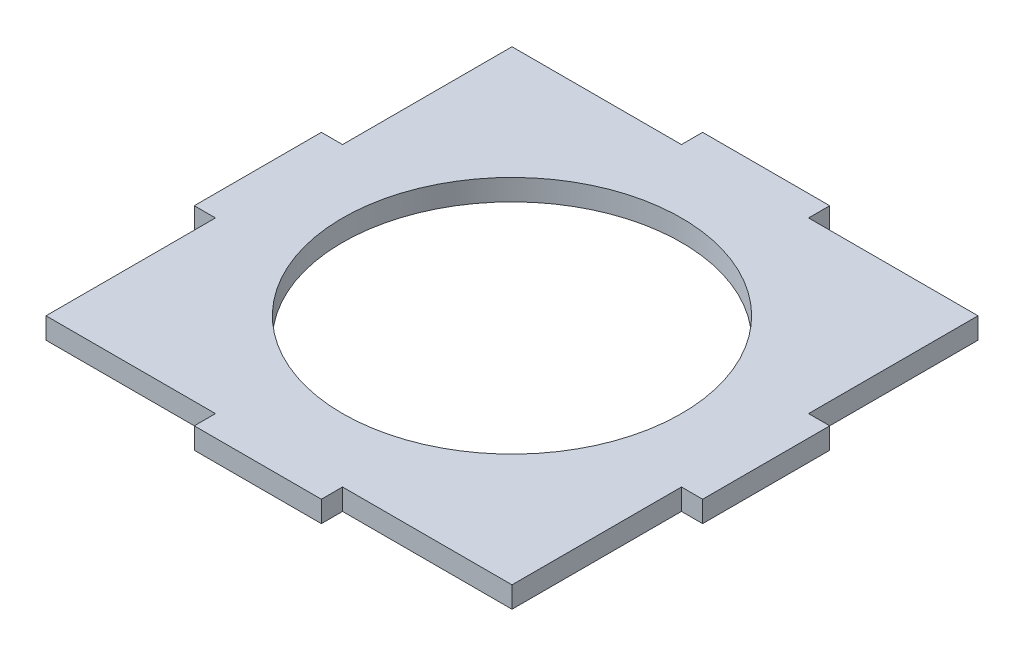
ISO-10303-21;
HEADER;
FILE_DESCRIPTION(('STEP AP214'),'2;1');
FILE_NAME('part.step','',(''),(''),'','','');
FILE_SCHEMA(('AUTOMOTIVE_DESIGN { 1 0 10303 214 1 1 1 1 }'));
ENDSEC;
DATA;
#1=APPLICATION_CONTEXT('core data for automotive mechanical design processes');
#2=APPLICATION_PROTOCOL_DEFINITION('international standard','automotive_design',2000,#1);
#3=PRODUCT_CONTEXT('',#1,'mechanical');
#4=PRODUCT('Part','Part','',(#3));
#5=PRODUCT_RELATED_PRODUCT_CATEGORY('part','',(#4));
#6=PRODUCT_DEFINITION_FORMATION('','',#4);
#7=PRODUCT_DEFINITION_CONTEXT('part definition',#1,'design');
#8=PRODUCT_DEFINITION('design','',#6,#7);
#9=PRODUCT_DEFINITION_SHAPE('','',#8);
#10=(LENGTH_UNIT() NAMED_UNIT(*) SI_UNIT(.MILLI.,.METRE.));
#11=(NAMED_UNIT(*) PLANE_ANGLE_UNIT() SI_UNIT($,.RADIAN.));
#12=(NAMED_UNIT(*) SI_UNIT($,.STERADIAN.) SOLID_ANGLE_UNIT());
#13=UNCERTAINTY_MEASURE_WITH_UNIT(LENGTH_MEASURE(1.E-05),#10,'distance_accuracy_value','');
#14=(GEOMETRIC_REPRESENTATION_CONTEXT(3) GLOBAL_UNCERTAINTY_ASSIGNED_CONTEXT((#13)) GLOBAL_UNIT_ASSIGNED_CONTEXT((#10,
#11,#12)) REPRESENTATION_CONTEXT('',''));
#15=CARTESIAN_POINT('',(0.,0.,0.));
#16=DIRECTION('',(0.,0.,1.));
#17=DIRECTION('',(1.,0.,0.));
#18=AXIS2_PLACEMENT_3D('',#15,#16,#17);
#19=CARTESIAN_POINT('',(0.,6.35,27.1778189414841));
#20=DIRECTION('',(0.,0.,-1.));
#21=DIRECTION('',(-1.,0.,0.));
#22=AXIS2_PLACEMENT_3D('',#19,#20,#21);
#23=PLANE('',#22);
#24=DIRECTION('',(1.,0.,0.));
#25=VECTOR('',#24,1.);
#26=CARTESIAN_POINT('',(0.,0.,27.1778189414841));
#27=LINE('',#26,#25);
#28=CARTESIAN_POINT('',(-42.6264417650752,0.,27.1778189414841));
#29=VERTEX_POINT('',#28);
#30=CARTESIAN_POINT('',(8.17355823492479,0.,27.1778189414841));
#31=VERTEX_POINT('',#30);
#32=EDGE_CURVE('E204',#29,#31,#27,.T.);
#33=ORIENTED_EDGE('',*,*,#32,.T.);
#34=DIRECTION('',(0.,-1.,0.));
#35=VECTOR('',#34,1.);
#36=CARTESIAN_POINT('',(8.17355823492479,6.35,27.1778189414841));
#37=LINE('',#36,#35);
#38=CARTESIAN_POINT('',(8.17355823492479,6.35,27.1778189414841));
#39=VERTEX_POINT('',#38);
#40=EDGE_CURVE('E11',#39,#31,#37,.T.);
#41=ORIENTED_EDGE('',*,*,#40,.F.);
#42=DIRECTION('',(1.,0.,0.));
#43=VECTOR('',#42,1.);
#44=CARTESIAN_POINT('',(0.,6.35,27.1778189414841));
#45=LINE('',#44,#43);
#46=CARTESIAN_POINT('',(-42.6264417650752,6.35,27.1778189414841));
#47=VERTEX_POINT('',#46);
#48=EDGE_CURVE('E305',#47,#39,#45,.T.);
#49=ORIENTED_EDGE('',*,*,#48,.F.);
#50=DIRECTION('',(0.,-1.,0.));
#51=VECTOR('',#50,1.);
#52=CARTESIAN_POINT('',(-42.6264417650752,6.35,27.1778189414841));
#53=LINE('',#52,#51);
#54=EDGE_CURVE('E196',#47,#29,#53,.T.);
#55=ORIENTED_EDGE('',*,*,#54,.T.);
#56=EDGE_LOOP('',(#33,#41,#49,#55));
#57=FACE_BOUND('',#56,.T.);
#58=ADVANCED_FACE('F33',(#57),#23,.F.);
#59=CARTESIAN_POINT('',(8.17355823492479,6.35,0.));
#60=DIRECTION('',(1.,0.,0.));
#61=DIRECTION('',(0.,0.,-1.));
#62=AXIS2_PLACEMENT_3D('',#59,#60,#61);
#63=PLANE('',#62);
#64=DIRECTION('',(0.,0.,1.));
#65=VECTOR('',#64,1.);
#66=CARTESIAN_POINT('',(8.17355823492479,0.,0.));
#67=LINE('',#66,#65);
#68=CARTESIAN_POINT('',(8.17355823492479,0.,33.5278189414841));
#69=VERTEX_POINT('',#68);
#70=EDGE_CURVE('E207',#31,#69,#67,.T.);
#71=ORIENTED_EDGE('',*,*,#70,.T.);
#72=DIRECTION('',(0.,-1.,0.));
#73=VECTOR('',#72,1.);
#74=CARTESIAN_POINT('',(8.17355823492479,6.35,33.5278189414841));
#75=LINE('',#74,#73);
#76=CARTESIAN_POINT('',(8.17355823492479,6.35,33.5278189414841));
#77=VERTEX_POINT('',#76);
#78=EDGE_CURVE('E42',#77,#69,#75,.T.);
#79=ORIENTED_EDGE('',*,*,#78,.F.);
#80=DIRECTION('',(0.,0.,1.));
#81=VECTOR('',#80,1.);
#82=CARTESIAN_POINT('',(8.17355823492479,6.35,0.));
#83=LINE('',#82,#81);
#84=EDGE_CURVE('E125',#39,#77,#83,.T.);
#85=ORIENTED_EDGE('',*,*,#84,.F.);
#86=ORIENTED_EDGE('',*,*,#40,.T.);
#87=EDGE_LOOP('',(#71,#79,#85,#86));
#88=FACE_BOUND('',#87,.T.);
#89=ADVANCED_FACE('F288',(#88),#63,.F.);
#90=CARTESIAN_POINT('',(0.,6.35,33.5278189414841));
#91=DIRECTION('',(0.,0.,1.));
#92=DIRECTION('',(1.,0.,0.));
#93=AXIS2_PLACEMENT_3D('',#90,#91,#92);
#94=PLANE('',#93);
#95=DIRECTION('',(-1.,0.,0.));
#96=VECTOR('',#95,1.);
#97=CARTESIAN_POINT('',(0.,0.,33.5278189414841));
#98=LINE('',#97,#96);
#99=CARTESIAN_POINT('',(46.2735582349248,0.,33.5278189414841));
#100=VERTEX_POINT('',#99);
#101=EDGE_CURVE('E211',#100,#69,#98,.T.);
#102=ORIENTED_EDGE('',*,*,#101,.F.);
#103=DIRECTION('',(0.,-1.,0.));
#104=VECTOR('',#103,1.);
#105=CARTESIAN_POINT('',(46.2735582349248,6.35,33.5278189414841));
#106=LINE('',#105,#104);
#107=CARTESIAN_POINT('',(46.2735582349248,6.35,33.5278189414841));
#108=VERTEX_POINT('',#107);
#109=EDGE_CURVE('E281',#108,#100,#106,.T.);
#110=ORIENTED_EDGE('',*,*,#109,.F.);
#111=DIRECTION('',(-1.,0.,0.));
#112=VECTOR('',#111,1.);
#113=CARTESIAN_POINT('',(0.,6.35,33.5278189414841));
#114=LINE('',#113,#112);
#115=EDGE_CURVE('E287',#108,#77,#114,.T.);
#116=ORIENTED_EDGE('',*,*,#115,.T.);
#117=ORIENTED_EDGE('',*,*,#78,.T.);
#118=EDGE_LOOP('',(#102,#110,#116,#117));
#119=FACE_BOUND('',#118,.T.);
#120=ADVANCED_FACE('F285',(#119),#94,.T.);
#121=CARTESIAN_POINT('',(46.2735582349248,6.35,0.));
#122=DIRECTION('',(1.,0.,0.));
#123=DIRECTION('',(0.,0.,-1.));
#124=AXIS2_PLACEMENT_3D('',#121,#122,#123);
#125=PLANE('',#124);
#126=DIRECTION('',(0.,0.,1.));
#127=VECTOR('',#126,1.);
#128=CARTESIAN_POINT('',(46.2735582349248,0.,0.));
#129=LINE('',#128,#127);
#130=CARTESIAN_POINT('',(46.2735582349248,0.,27.1778189414841));
#131=VERTEX_POINT('',#130);
#132=EDGE_CURVE('E214',#131,#100,#129,.T.);
#133=ORIENTED_EDGE('',*,*,#132,.F.);
#134=DIRECTION('',(0.,-1.,0.));
#135=VECTOR('',#134,1.);
#136=CARTESIAN_POINT('',(46.2735582349248,6.35,27.1778189414841));
#137=LINE('',#136,#135);
#138=CARTESIAN_POINT('',(46.2735582349248,6.35,27.1778189414841));
#139=VERTEX_POINT('',#138);
#140=EDGE_CURVE('E279',#139,#131,#137,.T.);
#141=ORIENTED_EDGE('',*,*,#140,.F.);
#142=DIRECTION('',(0.,0.,1.));
#143=VECTOR('',#142,1.);
#144=CARTESIAN_POINT('',(46.2735582349248,6.35,0.));
#145=LINE('',#144,#143);
#146=EDGE_CURVE('E301',#139,#108,#145,.T.);
#147=ORIENTED_EDGE('',*,*,#146,.T.);
#148=ORIENTED_EDGE('',*,*,#109,.T.);
#149=EDGE_LOOP('',(#133,#141,#147,#148));
#150=FACE_BOUND('',#149,.T.);
#151=ADVANCED_FACE('F297',(#150),#125,.T.);
#152=CARTESIAN_POINT('',(97.0735582349248,0.,27.1778189414841));
#153=VERTEX_POINT('',#152);
#154=EDGE_CURVE('E208',#131,#153,#27,.T.);
#155=ORIENTED_EDGE('',*,*,#154,.T.);
#156=DIRECTION('',(0.,-1.,0.));
#157=VECTOR('',#156,1.);
#158=CARTESIAN_POINT('',(97.0735582349248,6.35,27.1778189414841));
#159=LINE('',#158,#157);
#160=CARTESIAN_POINT('',(97.0735582349248,6.35,27.1778189414841));
#161=VERTEX_POINT('',#160);
#162=EDGE_CURVE('E277',#161,#153,#159,.T.);
#163=ORIENTED_EDGE('',*,*,#162,.F.);
#164=EDGE_CURVE('E303',#139,#161,#45,.T.);
#165=ORIENTED_EDGE('',*,*,#164,.F.);
#166=ORIENTED_EDGE('',*,*,#140,.T.);
#167=EDGE_LOOP('',(#155,#163,#165,#166));
#168=FACE_BOUND('',#167,.T.);
#169=ADVANCED_FACE('F360',(#168),#23,.F.);
#170=CARTESIAN_POINT('',(97.0735582349248,6.35,0.));
#171=DIRECTION('',(1.,0.,0.));
#172=DIRECTION('',(0.,0.,-1.));
#173=AXIS2_PLACEMENT_3D('',#170,#171,#172);
#174=PLANE('',#173);
#175=DIRECTION('',(0.,0.,1.));
#176=VECTOR('',#175,1.);
#177=CARTESIAN_POINT('',(97.0735582349248,0.,0.));
#178=LINE('',#177,#176);
#179=CARTESIAN_POINT('',(97.0735582349248,0.,-23.6221810585159));
#180=VERTEX_POINT('',#179);
#181=EDGE_CURVE('E217',#180,#153,#178,.T.);
#182=ORIENTED_EDGE('',*,*,#181,.F.);
#183=DIRECTION('',(0.,-1.,0.));
#184=VECTOR('',#183,1.);
#185=CARTESIAN_POINT('',(97.0735582349248,6.35,-23.6221810585159));
#186=LINE('',#185,#184);
#187=CARTESIAN_POINT('',(97.0735582349248,6.35,-23.6221810585159));
#188=VERTEX_POINT('',#187);
#189=EDGE_CURVE('E275',#188,#180,#186,.T.);
#190=ORIENTED_EDGE('',*,*,#189,.F.);
#191=DIRECTION('',(0.,0.,1.));
#192=VECTOR('',#191,1.);
#193=CARTESIAN_POINT('',(97.0735582349248,6.35,0.));
#194=LINE('',#193,#192);
#195=EDGE_CURVE('E309',#188,#161,#194,.T.);
#196=ORIENTED_EDGE('',*,*,#195,.T.);
#197=ORIENTED_EDGE('',*,*,#162,.T.);
#198=EDGE_LOOP('',(#182,#190,#196,#197));
#199=FACE_BOUND('',#198,.T.);
#200=ADVANCED_FACE('F363',(#199),#174,.T.);
#201=CARTESIAN_POINT('',(0.,6.35,-23.6221810585158));
#202=DIRECTION('',(0.,0.,-1.));
#203=DIRECTION('',(-1.,0.,0.));
#204=AXIS2_PLACEMENT_3D('',#201,#202,#203);
#205=PLANE('',#204);
#206=DIRECTION('',(1.,0.,0.));
#207=VECTOR('',#206,1.);
#208=CARTESIAN_POINT('',(0.,0.,-23.6221810585158));
#209=LINE('',#208,#207);
#210=CARTESIAN_POINT('',(103.423558234925,0.,-23.6221810585159));
#211=VERTEX_POINT('',#210);
#212=EDGE_CURVE('E220',#180,#211,#209,.T.);
#213=ORIENTED_EDGE('',*,*,#212,.T.);
#214=DIRECTION('',(0.,-1.,0.));
#215=VECTOR('',#214,1.);
#216=CARTESIAN_POINT('',(103.423558234925,6.35,-23.6221810585159));
#217=LINE('',#216,#215);
#218=CARTESIAN_POINT('',(103.423558234925,6.35,-23.6221810585159));
#219=VERTEX_POINT('',#218);
#220=EDGE_CURVE('E272',#219,#211,#217,.T.);
#221=ORIENTED_EDGE('',*,*,#220,.F.);
#222=DIRECTION('',(1.,0.,0.));
#223=VECTOR('',#222,1.);
#224=CARTESIAN_POINT('',(0.,6.35,-23.6221810585158));
#225=LINE('',#224,#223);
#226=EDGE_CURVE('E312',#188,#219,#225,.T.);
#227=ORIENTED_EDGE('',*,*,#226,.F.);
#228=ORIENTED_EDGE('',*,*,#189,.T.);
#229=EDGE_LOOP('',(#213,#221,#227,#228));
#230=FACE_BOUND('',#229,.T.);
#231=ADVANCED_FACE('F368',(#230),#205,.F.);
#232=CARTESIAN_POINT('',(103.423558234925,6.35,0.));
#233=DIRECTION('',(-1.,0.,0.));
#234=DIRECTION('',(0.,0.,1.));
#235=AXIS2_PLACEMENT_3D('',#232,#233,#234);
#236=PLANE('',#235);
#237=DIRECTION('',(0.,0.,-1.));
#238=VECTOR('',#237,1.);
#239=CARTESIAN_POINT('',(103.423558234925,0.,0.));
#240=LINE('',#239,#238);
#241=CARTESIAN_POINT('',(103.423558234925,0.,-61.7221810585159));
#242=VERTEX_POINT('',#241);
#243=EDGE_CURVE('E223',#211,#242,#240,.T.);
#244=ORIENTED_EDGE('',*,*,#243,.T.);
#245=DIRECTION('',(0.,-1.,0.));
#246=VECTOR('',#245,1.);
#247=CARTESIAN_POINT('',(103.423558234925,6.35,-61.7221810585159));
#248=LINE('',#247,#246);
#249=CARTESIAN_POINT('',(103.423558234925,6.35,-61.7221810585159));
#250=VERTEX_POINT('',#249);
#251=EDGE_CURVE('E270',#250,#242,#248,.T.);
#252=ORIENTED_EDGE('',*,*,#251,.F.);
#253=DIRECTION('',(0.,0.,-1.));
#254=VECTOR('',#253,1.);
#255=CARTESIAN_POINT('',(103.423558234925,6.35,0.));
#256=LINE('',#255,#254);
#257=EDGE_CURVE('E315',#219,#250,#256,.T.);
#258=ORIENTED_EDGE('',*,*,#257,.F.);
#259=ORIENTED_EDGE('',*,*,#220,.T.);
#260=EDGE_LOOP('',(#244,#252,#258,#259));
#261=FACE_BOUND('',#260,.T.);
#262=ADVANCED_FACE('F375',(#261),#236,.F.);
#263=CARTESIAN_POINT('',(0.,6.35,-61.7221810585158));
#264=DIRECTION('',(0.,0.,-1.));
#265=DIRECTION('',(-1.,0.,0.));
#266=AXIS2_PLACEMENT_3D('',#263,#264,#265);
#267=PLANE('',#266);
#268=DIRECTION('',(1.,0.,0.));
#269=VECTOR('',#268,1.);
#270=CARTESIAN_POINT('',(0.,0.,-61.7221810585158));
#271=LINE('',#270,#269);
#272=CARTESIAN_POINT('',(97.0735582349248,0.,-61.7221810585159));
#273=VERTEX_POINT('',#272);
#274=EDGE_CURVE('E226',#273,#242,#271,.T.);
#275=ORIENTED_EDGE('',*,*,#274,.F.);
#276=DIRECTION('',(0.,-1.,0.));
#277=VECTOR('',#276,1.);
#278=CARTESIAN_POINT('',(97.0735582349248,6.35,-61.7221810585159));
#279=LINE('',#278,#277);
#280=CARTESIAN_POINT('',(97.0735582349248,6.35,-61.7221810585159));
#281=VERTEX_POINT('',#280);
#282=EDGE_CURVE('E268',#281,#273,#279,.T.);
#283=ORIENTED_EDGE('',*,*,#282,.F.);
#284=DIRECTION('',(1.,0.,0.));
#285=VECTOR('',#284,1.);
#286=CARTESIAN_POINT('',(0.,6.35,-61.7221810585158));
#287=LINE('',#286,#285);
#288=EDGE_CURVE('E317',#281,#250,#287,.T.);
#289=ORIENTED_EDGE('',*,*,#288,.T.);
#290=ORIENTED_EDGE('',*,*,#251,.T.);
#291=EDGE_LOOP('',(#275,#283,#289,#290));
#292=FACE_BOUND('',#291,.T.);
#293=ADVANCED_FACE('F379',(#292),#267,.T.);
#294=CARTESIAN_POINT('',(97.0735582349248,0.,-112.522181058516));
#295=VERTEX_POINT('',#294);
#296=EDGE_CURVE('E221',#295,#273,#178,.T.);
#297=ORIENTED_EDGE('',*,*,#296,.F.);
#298=DIRECTION('',(0.,-1.,0.));
#299=VECTOR('',#298,1.);
#300=CARTESIAN_POINT('',(97.0735582349248,6.35,-112.522181058516));
#301=LINE('',#300,#299);
#302=CARTESIAN_POINT('',(97.0735582349248,6.35,-112.522181058516));
#303=VERTEX_POINT('',#302);
#304=EDGE_CURVE('E266',#303,#295,#301,.T.);
#305=ORIENTED_EDGE('',*,*,#304,.F.);
#306=EDGE_CURVE('E313',#303,#281,#194,.T.);
#307=ORIENTED_EDGE('',*,*,#306,.T.);
#308=ORIENTED_EDGE('',*,*,#282,.T.);
#309=EDGE_LOOP('',(#297,#305,#307,#308));
#310=FACE_BOUND('',#309,.T.);
#311=ADVANCED_FACE('F383',(#310),#174,.T.);
#312=CARTESIAN_POINT('',(0.,6.35,-112.522181058516));
#313=DIRECTION('',(0.,0.,-1.));
#314=DIRECTION('',(-1.,0.,0.));
#315=AXIS2_PLACEMENT_3D('',#312,#313,#314);
#316=PLANE('',#315);
#317=DIRECTION('',(1.,0.,0.));
#318=VECTOR('',#317,1.);
#319=CARTESIAN_POINT('',(0.,0.,-112.522181058516));
#320=LINE('',#319,#318);
#321=CARTESIAN_POINT('',(46.2735582349248,0.,-112.522181058516));
#322=VERTEX_POINT('',#321);
#323=EDGE_CURVE('E229',#322,#295,#320,.T.);
#324=ORIENTED_EDGE('',*,*,#323,.F.);
#325=DIRECTION('',(0.,-1.,0.));
#326=VECTOR('',#325,1.);
#327=CARTESIAN_POINT('',(46.2735582349248,6.35,-112.522181058516));
#328=LINE('',#327,#326);
#329=CARTESIAN_POINT('',(46.2735582349248,6.35,-112.522181058516));
#330=VERTEX_POINT('',#329);
#331=EDGE_CURVE('E264',#330,#322,#328,.T.);
#332=ORIENTED_EDGE('',*,*,#331,.F.);
#333=DIRECTION('',(1.,0.,0.));
#334=VECTOR('',#333,1.);
#335=CARTESIAN_POINT('',(0.,6.35,-112.522181058516));
#336=LINE('',#335,#334);
#337=EDGE_CURVE('E320',#330,#303,#336,.T.);
#338=ORIENTED_EDGE('',*,*,#337,.T.);
#339=ORIENTED_EDGE('',*,*,#304,.T.);
#340=EDGE_LOOP('',(#324,#332,#338,#339));
#341=FACE_BOUND('',#340,.T.);
#342=ADVANCED_FACE('F387',(#341),#316,.T.);
#343=CARTESIAN_POINT('',(46.2735582349248,6.35,0.));
#344=DIRECTION('',(-1.,0.,0.));
#345=DIRECTION('',(0.,0.,1.));
#346=AXIS2_PLACEMENT_3D('',#343,#344,#345);
#347=PLANE('',#346);
#348=DIRECTION('',(0.,0.,-1.));
#349=VECTOR('',#348,1.);
#350=CARTESIAN_POINT('',(46.2735582349248,0.,0.));
#351=LINE('',#350,#349);
#352=CARTESIAN_POINT('',(46.2735582349248,0.,-118.872181058516));
#353=VERTEX_POINT('',#352);
#354=EDGE_CURVE('E232',#322,#353,#351,.T.);
#355=ORIENTED_EDGE('',*,*,#354,.T.);
#356=DIRECTION('',(0.,-1.,0.));
#357=VECTOR('',#356,1.);
#358=CARTESIAN_POINT('',(46.2735582349248,6.35,-118.872181058516));
#359=LINE('',#358,#357);
#360=CARTESIAN_POINT('',(46.2735582349248,6.35,-118.872181058516));
#361=VERTEX_POINT('',#360);
#362=EDGE_CURVE('E261',#361,#353,#359,.T.);
#363=ORIENTED_EDGE('',*,*,#362,.F.);
#364=DIRECTION('',(0.,0.,-1.));
#365=VECTOR('',#364,1.);
#366=CARTESIAN_POINT('',(46.2735582349248,6.35,0.));
#367=LINE('',#366,#365);
#368=EDGE_CURVE('E323',#330,#361,#367,.T.);
#369=ORIENTED_EDGE('',*,*,#368,.F.);
#370=ORIENTED_EDGE('',*,*,#331,.T.);
#371=EDGE_LOOP('',(#355,#363,#369,#370));
#372=FACE_BOUND('',#371,.T.);
#373=ADVANCED_FACE('F392',(#372),#347,.F.);
#374=CARTESIAN_POINT('',(0.,6.35,-118.872181058516));
#375=DIRECTION('',(0.,0.,1.));
#376=DIRECTION('',(1.,0.,0.));
#377=AXIS2_PLACEMENT_3D('',#374,#375,#376);
#378=PLANE('',#377);
#379=DIRECTION('',(-1.,0.,0.));
#380=VECTOR('',#379,1.);
#381=CARTESIAN_POINT('',(0.,0.,-118.872181058516));
#382=LINE('',#381,#380);
#383=CARTESIAN_POINT('',(8.17355823492476,0.,-118.872181058516));
#384=VERTEX_POINT('',#383);
#385=EDGE_CURVE('E235',#353,#384,#382,.T.);
#386=ORIENTED_EDGE('',*,*,#385,.T.);
#387=DIRECTION('',(0.,-1.,0.));
#388=VECTOR('',#387,1.);
#389=CARTESIAN_POINT('',(8.17355823492476,6.35,-118.872181058516));
#390=LINE('',#389,#388);
#391=CARTESIAN_POINT('',(8.17355823492476,6.35,-118.872181058516));
#392=VERTEX_POINT('',#391);
#393=EDGE_CURVE('E259',#392,#384,#390,.T.);
#394=ORIENTED_EDGE('',*,*,#393,.F.);
#395=DIRECTION('',(-1.,0.,0.));
#396=VECTOR('',#395,1.);
#397=CARTESIAN_POINT('',(0.,6.35,-118.872181058516));
#398=LINE('',#397,#396);
#399=EDGE_CURVE('E326',#361,#392,#398,.T.);
#400=ORIENTED_EDGE('',*,*,#399,.F.);
#401=ORIENTED_EDGE('',*,*,#362,.T.);
#402=EDGE_LOOP('',(#386,#394,#400,#401));
#403=FACE_BOUND('',#402,.T.);
#404=ADVANCED_FACE('F394',(#403),#378,.F.);
#405=CARTESIAN_POINT('',(8.17355823492476,6.35,0.));
#406=DIRECTION('',(-1.,0.,0.));
#407=DIRECTION('',(0.,0.,1.));
#408=AXIS2_PLACEMENT_3D('',#405,#406,#407);
#409=PLANE('',#408);
#410=DIRECTION('',(0.,0.,-1.));
#411=VECTOR('',#410,1.);
#412=CARTESIAN_POINT('',(8.17355823492476,0.,0.));
#413=LINE('',#412,#411);
#414=CARTESIAN_POINT('',(8.17355823492476,0.,-112.522181058516));
#415=VERTEX_POINT('',#414);
#416=EDGE_CURVE('E238',#415,#384,#413,.T.);
#417=ORIENTED_EDGE('',*,*,#416,.F.);
#418=DIRECTION('',(0.,-1.,0.));
#419=VECTOR('',#418,1.);
#420=CARTESIAN_POINT('',(8.17355823492476,6.35,-112.522181058516));
#421=LINE('',#420,#419);
#422=CARTESIAN_POINT('',(8.17355823492476,6.35,-112.522181058516));
#423=VERTEX_POINT('',#422);
#424=EDGE_CURVE('E257',#423,#415,#421,.T.);
#425=ORIENTED_EDGE('',*,*,#424,.F.);
#426=DIRECTION('',(0.,0.,-1.));
#427=VECTOR('',#426,1.);
#428=CARTESIAN_POINT('',(8.17355823492476,6.35,0.));
#429=LINE('',#428,#427);
#430=EDGE_CURVE('E328',#423,#392,#429,.T.);
#431=ORIENTED_EDGE('',*,*,#430,.T.);
#432=ORIENTED_EDGE('',*,*,#393,.T.);
#433=EDGE_LOOP('',(#417,#425,#431,#432));
#434=FACE_BOUND('',#433,.T.);
#435=ADVANCED_FACE('F342',(#434),#409,.T.);
#436=CARTESIAN_POINT('',(-42.6264417650753,0.,-112.522181058516));
#437=VERTEX_POINT('',#436);
#438=EDGE_CURVE('E233',#437,#415,#320,.T.);
#439=ORIENTED_EDGE('',*,*,#438,.F.);
#440=DIRECTION('',(0.,-1.,0.));
#441=VECTOR('',#440,1.);
#442=CARTESIAN_POINT('',(-42.6264417650753,6.35,-112.522181058516));
#443=LINE('',#442,#441);
#444=CARTESIAN_POINT('',(-42.6264417650753,6.35,-112.522181058516));
#445=VERTEX_POINT('',#444);
#446=EDGE_CURVE('E255',#445,#437,#443,.T.);
#447=ORIENTED_EDGE('',*,*,#446,.F.);
#448=EDGE_CURVE('E324',#445,#423,#336,.T.);
#449=ORIENTED_EDGE('',*,*,#448,.T.);
#450=ORIENTED_EDGE('',*,*,#424,.T.);
#451=EDGE_LOOP('',(#439,#447,#449,#450));
#452=FACE_BOUND('',#451,.T.);
#453=ADVANCED_FACE('F336',(#452),#316,.T.);
#454=CARTESIAN_POINT('',(-42.6264417650752,6.35,0.));
#455=DIRECTION('',(1.,0.,0.));
#456=DIRECTION('',(0.,0.,-1.));
#457=AXIS2_PLACEMENT_3D('',#454,#455,#456);
#458=PLANE('',#457);
#459=DIRECTION('',(0.,0.,1.));
#460=VECTOR('',#459,1.);
#461=CARTESIAN_POINT('',(-42.6264417650752,0.,0.));
#462=LINE('',#461,#460);
#463=CARTESIAN_POINT('',(-42.6264417650752,0.,-61.7221810585158));
#464=VERTEX_POINT('',#463);
#465=EDGE_CURVE('E241',#437,#464,#462,.T.);
#466=ORIENTED_EDGE('',*,*,#465,.T.);
#467=DIRECTION('',(0.,-1.,0.));
#468=VECTOR('',#467,1.);
#469=CARTESIAN_POINT('',(-42.6264417650752,6.35,-61.7221810585158));
#470=LINE('',#469,#468);
#471=CARTESIAN_POINT('',(-42.6264417650752,6.35,-61.7221810585158));
#472=VERTEX_POINT('',#471);
#473=EDGE_CURVE('E252',#472,#464,#470,.T.);
#474=ORIENTED_EDGE('',*,*,#473,.F.);
#475=DIRECTION('',(0.,0.,1.));
#476=VECTOR('',#475,1.);
#477=CARTESIAN_POINT('',(-42.6264417650752,6.35,0.));
#478=LINE('',#477,#476);
#479=EDGE_CURVE('E198',#445,#472,#478,.T.);
#480=ORIENTED_EDGE('',*,*,#479,.F.);
#481=ORIENTED_EDGE('',*,*,#446,.T.);
#482=EDGE_LOOP('',(#466,#474,#480,#481));
#483=FACE_BOUND('',#482,.T.);
#484=ADVANCED_FACE('F348',(#483),#458,.F.);
#485=CARTESIAN_POINT('',(0.,6.35,-61.7221810585158));
#486=DIRECTION('',(0.,0.,1.));
#487=DIRECTION('',(1.,0.,0.));
#488=AXIS2_PLACEMENT_3D('',#485,#486,#487);
#489=PLANE('',#488);
#490=DIRECTION('',(-1.,0.,0.));
#491=VECTOR('',#490,1.);
#492=CARTESIAN_POINT('',(0.,0.,-61.7221810585158));
#493=LINE('',#492,#491);
#494=CARTESIAN_POINT('',(-48.9764417650753,0.,-61.7221810585158));
#495=VERTEX_POINT('',#494);
#496=EDGE_CURVE('E243',#464,#495,#493,.T.);
#497=ORIENTED_EDGE('',*,*,#496,.T.);
#498=DIRECTION('',(0.,-1.,0.));
#499=VECTOR('',#498,1.);
#500=CARTESIAN_POINT('',(-48.9764417650753,6.35,-61.7221810585158));
#501=LINE('',#500,#499);
#502=CARTESIAN_POINT('',(-48.9764417650753,6.35,-61.7221810585158));
#503=VERTEX_POINT('',#502);
#504=EDGE_CURVE('E186',#503,#495,#501,.T.);
#505=ORIENTED_EDGE('',*,*,#504,.F.);
#506=DIRECTION('',(-1.,0.,0.));
#507=VECTOR('',#506,1.);
#508=CARTESIAN_POINT('',(0.,6.35,-61.7221810585158));
#509=LINE('',#508,#507);
#510=EDGE_CURVE('E191',#472,#503,#509,.T.);
#511=ORIENTED_EDGE('',*,*,#510,.F.);
#512=ORIENTED_EDGE('',*,*,#473,.T.);
#513=EDGE_LOOP('',(#497,#505,#511,#512));
#514=FACE_BOUND('',#513,.T.);
#515=ADVANCED_FACE('F350',(#514),#489,.F.);
#516=CARTESIAN_POINT('',(-48.9764417650752,6.35,0.));
#517=DIRECTION('',(-1.,0.,0.));
#518=DIRECTION('',(0.,0.,1.));
#519=AXIS2_PLACEMENT_3D('',#516,#517,#518);
#520=PLANE('',#519);
#521=DIRECTION('',(0.,0.,-1.));
#522=VECTOR('',#521,1.);
#523=CARTESIAN_POINT('',(-48.9764417650752,0.,0.));
#524=LINE('',#523,#522);
#525=CARTESIAN_POINT('',(-48.9764417650752,0.,-23.6221810585158));
#526=VERTEX_POINT('',#525);
#527=EDGE_CURVE('E181',#526,#495,#524,.T.);
#528=ORIENTED_EDGE('',*,*,#527,.F.);
#529=DIRECTION('',(0.,-1.,0.));
#530=VECTOR('',#529,1.);
#531=CARTESIAN_POINT('',(-48.9764417650752,6.35,-23.6221810585158));
#532=LINE('',#531,#530);
#533=CARTESIAN_POINT('',(-48.9764417650752,6.35,-23.6221810585158));
#534=VERTEX_POINT('',#533);
#535=EDGE_CURVE('E176',#534,#526,#532,.T.);
#536=ORIENTED_EDGE('',*,*,#535,.F.);
#537=DIRECTION('',(0.,0.,-1.));
#538=VECTOR('',#537,1.);
#539=CARTESIAN_POINT('',(-48.9764417650752,6.35,0.));
#540=LINE('',#539,#538);
#541=EDGE_CURVE('E179',#534,#503,#540,.T.);
#542=ORIENTED_EDGE('',*,*,#541,.T.);
#543=ORIENTED_EDGE('',*,*,#504,.T.);
#544=EDGE_LOOP('',(#528,#536,#542,#543));
#545=FACE_BOUND('',#544,.T.);
#546=ADVANCED_FACE('F178',(#545),#520,.T.);
#547=CARTESIAN_POINT('',(0.,6.35,-23.6221810585158));
#548=DIRECTION('',(0.,0.,1.));
#549=DIRECTION('',(1.,0.,0.));
#550=AXIS2_PLACEMENT_3D('',#547,#548,#549);
#551=PLANE('',#550);
#552=DIRECTION('',(-1.,0.,0.));
#553=VECTOR('',#552,1.);
#554=CARTESIAN_POINT('',(0.,0.,-23.6221810585158));
#555=LINE('',#554,#553);
#556=CARTESIAN_POINT('',(-42.6264417650752,0.,-23.6221810585158));
#557=VERTEX_POINT('',#556);
#558=EDGE_CURVE('E247',#557,#526,#555,.T.);
#559=ORIENTED_EDGE('',*,*,#558,.F.);
#560=DIRECTION('',(0.,-1.,0.));
#561=VECTOR('',#560,1.);
#562=CARTESIAN_POINT('',(-42.6264417650752,6.35,-23.6221810585158));
#563=LINE('',#562,#561);
#564=CARTESIAN_POINT('',(-42.6264417650752,6.35,-23.6221810585158));
#565=VERTEX_POINT('',#564);
#566=EDGE_CURVE('E114',#565,#557,#563,.T.);
#567=ORIENTED_EDGE('',*,*,#566,.F.);
#568=DIRECTION('',(-1.,0.,0.));
#569=VECTOR('',#568,1.);
#570=CARTESIAN_POINT('',(0.,6.35,-23.6221810585158));
#571=LINE('',#570,#569);
#572=EDGE_CURVE('E189',#565,#534,#571,.T.);
#573=ORIENTED_EDGE('',*,*,#572,.T.);
#574=ORIENTED_EDGE('',*,*,#535,.T.);
#575=EDGE_LOOP('',(#559,#567,#573,#574));
#576=FACE_BOUND('',#575,.T.);
#577=ADVANCED_FACE('F194',(#576),#551,.T.);
#578=CARTESIAN_POINT('',(27.2235582349248,6.35,-42.6721810585159));
#579=DIRECTION('',(0.,-1.,0.));
#580=DIRECTION('',(0.,0.,-1.));
#581=AXIS2_PLACEMENT_3D('',#578,#579,#580);
#582=CYLINDRICAL_SURFACE('',#581,50.8);
#583=CARTESIAN_POINT('',(27.2235582349248,6.35,-42.6721810585159));
#584=DIRECTION('',(0.,1.,0.));
#585=DIRECTION('',(0.,0.,1.));
#586=AXIS2_PLACEMENT_3D('',#583,#584,#585);
#587=CIRCLE('',#586,50.8);
#588=CARTESIAN_POINT('',(27.2235582349248,6.35,8.12781894148414));
#589=VERTEX_POINT('',#588);
#590=EDGE_CURVE('E351',#589,#589,#587,.T.);
#591=ORIENTED_EDGE('',*,*,#590,.T.);
#592=EDGE_LOOP('',(#591));
#593=FACE_BOUND('',#592,.T.);
#594=CARTESIAN_POINT('',(27.2235582349248,0.,-42.6721810585159));
#595=DIRECTION('',(0.,1.,0.));
#596=DIRECTION('',(0.,0.,1.));
#597=AXIS2_PLACEMENT_3D('',#594,#595,#596);
#598=CIRCLE('',#597,50.8);
#599=CARTESIAN_POINT('',(27.2235582349248,0.,8.12781894148414));
#600=VERTEX_POINT('',#599);
#601=EDGE_CURVE('E201',#600,#600,#598,.T.);
#602=ORIENTED_EDGE('',*,*,#601,.F.);
#603=EDGE_LOOP('',(#602));
#604=FACE_BOUND('',#603,.T.);
#605=ADVANCED_FACE('F35',(#593,#604),#582,.F.);
#606=EDGE_CURVE('E117',#557,#29,#462,.T.);
#607=ORIENTED_EDGE('',*,*,#606,.T.);
#608=ORIENTED_EDGE('',*,*,#54,.F.);
#609=EDGE_CURVE('E50',#565,#47,#478,.T.);
#610=ORIENTED_EDGE('',*,*,#609,.F.);
#611=ORIENTED_EDGE('',*,*,#566,.T.);
#612=EDGE_LOOP('',(#607,#608,#610,#611));
#613=FACE_BOUND('',#612,.T.);
#614=ADVANCED_FACE('F510',(#613),#458,.F.);
#615=CARTESIAN_POINT('',(0.,6.35,0.));
#616=DIRECTION('',(0.,1.,0.));
#617=DIRECTION('',(0.,0.,1.));
#618=AXIS2_PLACEMENT_3D('',#615,#616,#617);
#619=PLANE('',#618);
#620=ORIENTED_EDGE('',*,*,#590,.F.);
#621=EDGE_LOOP('',(#620));
#622=FACE_BOUND('',#621,.T.);
#623=ORIENTED_EDGE('',*,*,#48,.T.);
#624=ORIENTED_EDGE('',*,*,#84,.T.);
#625=ORIENTED_EDGE('',*,*,#115,.F.);
#626=ORIENTED_EDGE('',*,*,#146,.F.);
#627=ORIENTED_EDGE('',*,*,#164,.T.);
#628=ORIENTED_EDGE('',*,*,#195,.F.);
#629=ORIENTED_EDGE('',*,*,#226,.T.);
#630=ORIENTED_EDGE('',*,*,#257,.T.);
#631=ORIENTED_EDGE('',*,*,#288,.F.);
#632=ORIENTED_EDGE('',*,*,#306,.F.);
#633=ORIENTED_EDGE('',*,*,#337,.F.);
#634=ORIENTED_EDGE('',*,*,#368,.T.);
#635=ORIENTED_EDGE('',*,*,#399,.T.);
#636=ORIENTED_EDGE('',*,*,#430,.F.);
#637=ORIENTED_EDGE('',*,*,#448,.F.);
#638=ORIENTED_EDGE('',*,*,#479,.T.);
#639=ORIENTED_EDGE('',*,*,#510,.T.);
#640=ORIENTED_EDGE('',*,*,#541,.F.);
#641=ORIENTED_EDGE('',*,*,#572,.F.);
#642=ORIENTED_EDGE('',*,*,#609,.T.);
#643=EDGE_LOOP('',(#623,#624,#625,#626,#627,#628,#629,#630,#631,#632,#633,#634,#635,#636,#637,
#638,#639,#640,#641,#642));
#644=FACE_BOUND('',#643,.T.);
#645=ADVANCED_FACE('F188',(#622,#644),#619,.T.);
#646=CARTESIAN_POINT('',(0.,0.,0.));
#647=DIRECTION('',(0.,1.,0.));
#648=DIRECTION('',(0.,0.,1.));
#649=AXIS2_PLACEMENT_3D('',#646,#647,#648);
#650=PLANE('',#649);
#651=ORIENTED_EDGE('',*,*,#601,.T.);
#652=EDGE_LOOP('',(#651));
#653=FACE_BOUND('',#652,.T.);
#654=ORIENTED_EDGE('',*,*,#32,.F.);
#655=ORIENTED_EDGE('',*,*,#606,.F.);
#656=ORIENTED_EDGE('',*,*,#558,.T.);
#657=ORIENTED_EDGE('',*,*,#527,.T.);
#658=ORIENTED_EDGE('',*,*,#496,.F.);
#659=ORIENTED_EDGE('',*,*,#465,.F.);
#660=ORIENTED_EDGE('',*,*,#438,.T.);
#661=ORIENTED_EDGE('',*,*,#416,.T.);
#662=ORIENTED_EDGE('',*,*,#385,.F.);
#663=ORIENTED_EDGE('',*,*,#354,.F.);
#664=ORIENTED_EDGE('',*,*,#323,.T.);
#665=ORIENTED_EDGE('',*,*,#296,.T.);
#666=ORIENTED_EDGE('',*,*,#274,.T.);
#667=ORIENTED_EDGE('',*,*,#243,.F.);
#668=ORIENTED_EDGE('',*,*,#212,.F.);
#669=ORIENTED_EDGE('',*,*,#181,.T.);
#670=ORIENTED_EDGE('',*,*,#154,.F.);
#671=ORIENTED_EDGE('',*,*,#132,.T.);
#672=ORIENTED_EDGE('',*,*,#101,.T.);
#673=ORIENTED_EDGE('',*,*,#70,.F.);
#674=EDGE_LOOP('',(#654,#655,#656,#657,#658,#659,#660,#661,#662,#663,#664,#665,#666,#667,#668,
#669,#670,#671,#672,#673));
#675=FACE_BOUND('',#674,.T.);
#676=ADVANCED_FACE('F292',(#653,#675),#650,.F.);
#677=CLOSED_SHELL('',(#58,#89,#120,#151,#169,#200,#231,#262,#293,#311,#342,#373,#404,#435,#453,
#484,#515,#546,#577,#605,#614,#645,#676));
#678=MANIFOLD_SOLID_BREP('B2',#677);
#679=ADVANCED_BREP_SHAPE_REPRESENTATION('',(#18,#678),#14);
#680=SHAPE_DEFINITION_REPRESENTATION(#9,#679);
ENDSEC;
END-ISO-10303-21;
